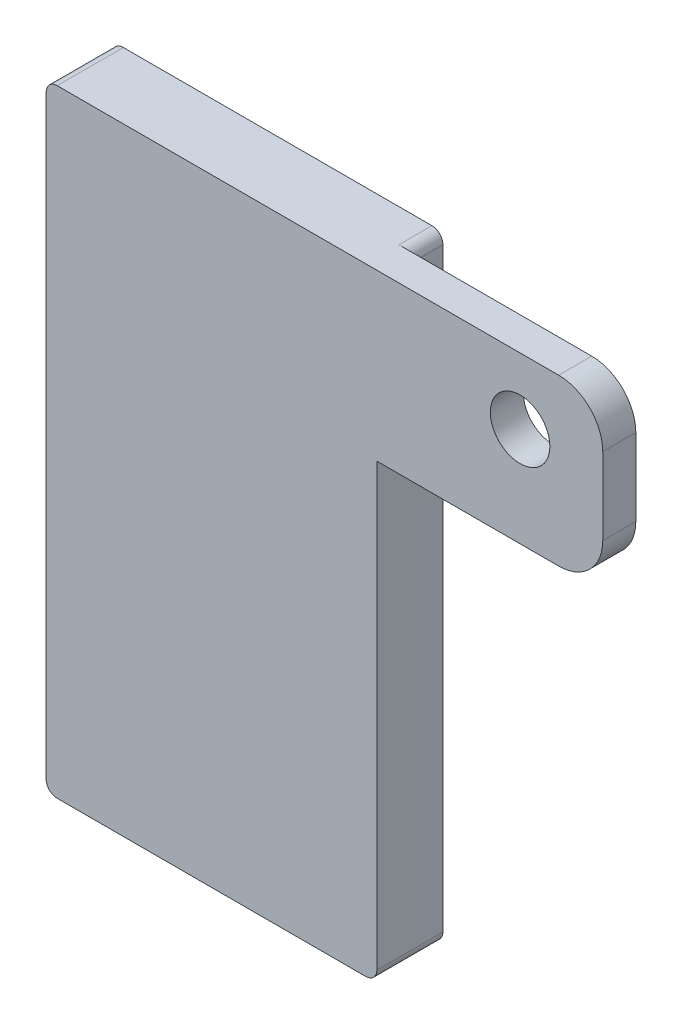
ISO-10303-21;
HEADER;
FILE_DESCRIPTION(('STEP AP214'),'2;1');
FILE_NAME('part.step','',(''),(''),'','','');
FILE_SCHEMA(('AUTOMOTIVE_DESIGN { 1 0 10303 214 1 1 1 1 }'));
ENDSEC;
DATA;
#1=APPLICATION_CONTEXT('core data for automotive mechanical design processes');
#2=APPLICATION_PROTOCOL_DEFINITION('international standard','automotive_design',2000,#1);
#3=PRODUCT_CONTEXT('',#1,'mechanical');
#4=PRODUCT('Part','Part','',(#3));
#5=PRODUCT_RELATED_PRODUCT_CATEGORY('part','',(#4));
#6=PRODUCT_DEFINITION_FORMATION('','',#4);
#7=PRODUCT_DEFINITION_CONTEXT('part definition',#1,'design');
#8=PRODUCT_DEFINITION('design','',#6,#7);
#9=PRODUCT_DEFINITION_SHAPE('','',#8);
#10=(LENGTH_UNIT() NAMED_UNIT(*) SI_UNIT(.MILLI.,.METRE.));
#11=(NAMED_UNIT(*) PLANE_ANGLE_UNIT() SI_UNIT($,.RADIAN.));
#12=(NAMED_UNIT(*) SI_UNIT($,.STERADIAN.) SOLID_ANGLE_UNIT());
#13=UNCERTAINTY_MEASURE_WITH_UNIT(LENGTH_MEASURE(1.E-05),#10,'distance_accuracy_value','');
#14=(GEOMETRIC_REPRESENTATION_CONTEXT(3) GLOBAL_UNCERTAINTY_ASSIGNED_CONTEXT((#13)) GLOBAL_UNIT_ASSIGNED_CONTEXT((#10,
#11,#12)) REPRESENTATION_CONTEXT('',''));
#15=CARTESIAN_POINT('',(0.,0.,0.));
#16=DIRECTION('',(0.,0.,1.));
#17=DIRECTION('',(1.,0.,0.));
#18=AXIS2_PLACEMENT_3D('',#15,#16,#17);
#19=CARTESIAN_POINT('',(0.,0.,3.));
#20=DIRECTION('',(0.,0.,-1.));
#21=DIRECTION('',(-1.,0.,0.));
#22=AXIS2_PLACEMENT_3D('',#19,#20,#21);
#23=PLANE('',#22);
#24=DIRECTION('',(-1.,0.,0.));
#25=VECTOR('',#24,1.);
#26=CARTESIAN_POINT('',(0.,56.,3.));
#27=LINE('',#26,#25);
#28=CARTESIAN_POINT('',(46.5,56.,3.));
#29=VERTEX_POINT('',#28);
#30=CARTESIAN_POINT('',(1.,56.,3.));
#31=VERTEX_POINT('',#30);
#32=EDGE_CURVE('E235',#29,#31,#27,.T.);
#33=ORIENTED_EDGE('',*,*,#32,.T.);
#34=CARTESIAN_POINT('',(1.,55.,3.));
#35=DIRECTION('',(0.,0.,-1.));
#36=DIRECTION('',(-1.,0.,0.));
#37=AXIS2_PLACEMENT_3D('',#34,#35,#36);
#38=CIRCLE('',#37,1.);
#39=CARTESIAN_POINT('',(0.,55.,3.));
#40=VERTEX_POINT('',#39);
#41=EDGE_CURVE('E293',#31,#40,#38,.F.);
#42=ORIENTED_EDGE('',*,*,#41,.T.);
#43=DIRECTION('',(0.,-1.,0.));
#44=VECTOR('',#43,1.);
#45=CARTESIAN_POINT('',(0.,0.,3.));
#46=LINE('',#45,#44);
#47=CARTESIAN_POINT('',(0.,1.,3.));
#48=VERTEX_POINT('',#47);
#49=EDGE_CURVE('E238',#40,#48,#46,.T.);
#50=ORIENTED_EDGE('',*,*,#49,.T.);
#51=CARTESIAN_POINT('',(1.,1.,3.));
#52=DIRECTION('',(0.,0.,-1.));
#53=DIRECTION('',(-1.,0.,0.));
#54=AXIS2_PLACEMENT_3D('',#51,#52,#53);
#55=CIRCLE('',#54,1.);
#56=CARTESIAN_POINT('',(1.00000000000001,0.,3.));
#57=VERTEX_POINT('',#56);
#58=EDGE_CURVE('E61',#48,#57,#55,.F.);
#59=ORIENTED_EDGE('',*,*,#58,.T.);
#60=DIRECTION('',(1.,0.,0.));
#61=VECTOR('',#60,1.);
#62=CARTESIAN_POINT('',(30.,0.,3.));
#63=LINE('',#62,#61);
#64=CARTESIAN_POINT('',(29.,0.,3.));
#65=VERTEX_POINT('',#64);
#66=EDGE_CURVE('E224',#57,#65,#63,.T.);
#67=ORIENTED_EDGE('',*,*,#66,.T.);
#68=CARTESIAN_POINT('',(29.,1.,3.));
#69=DIRECTION('',(0.,0.,-1.));
#70=DIRECTION('',(-1.,0.,0.));
#71=AXIS2_PLACEMENT_3D('',#68,#69,#70);
#72=CIRCLE('',#71,1.);
#73=CARTESIAN_POINT('',(30.,1.,3.));
#74=VERTEX_POINT('',#73);
#75=EDGE_CURVE('E290',#65,#74,#72,.F.);
#76=ORIENTED_EDGE('',*,*,#75,.T.);
#77=DIRECTION('',(0.,1.,0.));
#78=VECTOR('',#77,1.);
#79=CARTESIAN_POINT('',(30.,41.,3.));
#80=LINE('',#79,#78);
#81=CARTESIAN_POINT('',(30.,41.,3.));
#82=VERTEX_POINT('',#81);
#83=EDGE_CURVE('E226',#74,#82,#80,.T.);
#84=ORIENTED_EDGE('',*,*,#83,.T.);
#85=DIRECTION('',(1.,0.,0.));
#86=VECTOR('',#85,1.);
#87=CARTESIAN_POINT('',(50.5,41.,3.));
#88=LINE('',#87,#86);
#89=CARTESIAN_POINT('',(46.5,41.,3.));
#90=VERTEX_POINT('',#89);
#91=EDGE_CURVE('E229',#82,#90,#88,.T.);
#92=ORIENTED_EDGE('',*,*,#91,.T.);
#93=CARTESIAN_POINT('',(46.5,45.,3.));
#94=DIRECTION('',(0.,0.,-1.));
#95=DIRECTION('',(-1.,0.,0.));
#96=AXIS2_PLACEMENT_3D('',#93,#94,#95);
#97=CIRCLE('',#96,4.);
#98=CARTESIAN_POINT('',(50.5,45.,3.));
#99=VERTEX_POINT('',#98);
#100=EDGE_CURVE('E262',#90,#99,#97,.F.);
#101=ORIENTED_EDGE('',*,*,#100,.T.);
#102=DIRECTION('',(0.,1.,0.));
#103=VECTOR('',#102,1.);
#104=CARTESIAN_POINT('',(50.5,56.,3.));
#105=LINE('',#104,#103);
#106=CARTESIAN_POINT('',(50.5,52.,3.));
#107=VERTEX_POINT('',#106);
#108=EDGE_CURVE('E232',#99,#107,#105,.T.);
#109=ORIENTED_EDGE('',*,*,#108,.T.);
#110=CARTESIAN_POINT('',(46.5,52.,3.));
#111=DIRECTION('',(0.,0.,-1.));
#112=DIRECTION('',(-1.,0.,0.));
#113=AXIS2_PLACEMENT_3D('',#110,#111,#112);
#114=CIRCLE('',#113,4.);
#115=EDGE_CURVE('E260',#107,#29,#114,.F.);
#116=ORIENTED_EDGE('',*,*,#115,.T.);
#117=EDGE_LOOP('',(#33,#42,#50,#59,#67,#76,#84,#92,#101,#109,#116));
#118=FACE_BOUND('',#117,.T.);
#119=CARTESIAN_POINT('',(43.,50.,3.));
#120=DIRECTION('',(0.,0.,1.));
#121=DIRECTION('',(1.,0.,0.));
#122=AXIS2_PLACEMENT_3D('',#119,#120,#121);
#123=CIRCLE('',#122,2.7);
#124=CARTESIAN_POINT('',(45.7,50.,3.));
#125=VERTEX_POINT('',#124);
#126=EDGE_CURVE('E218',#125,#125,#123,.T.);
#127=ORIENTED_EDGE('',*,*,#126,.F.);
#128=EDGE_LOOP('',(#127));
#129=FACE_BOUND('',#128,.T.);
#130=ADVANCED_FACE('F39',(#118,#129),#23,.F.);
#131=CARTESIAN_POINT('',(0.,0.,0.));
#132=DIRECTION('',(0.,0.,-1.));
#133=DIRECTION('',(-1.,0.,0.));
#134=AXIS2_PLACEMENT_3D('',#131,#132,#133);
#135=PLANE('',#134);
#136=DIRECTION('',(0.,1.,0.));
#137=VECTOR('',#136,1.);
#138=CARTESIAN_POINT('',(50.5,56.,0.));
#139=LINE('',#138,#137);
#140=CARTESIAN_POINT('',(50.5,45.,0.));
#141=VERTEX_POINT('',#140);
#142=CARTESIAN_POINT('',(50.5,52.,0.));
#143=VERTEX_POINT('',#142);
#144=EDGE_CURVE('E243',#141,#143,#139,.T.);
#145=ORIENTED_EDGE('',*,*,#144,.F.);
#146=CARTESIAN_POINT('',(46.5,45.,0.));
#147=DIRECTION('',(0.,0.,-1.));
#148=DIRECTION('',(-1.,0.,0.));
#149=AXIS2_PLACEMENT_3D('',#146,#147,#148);
#150=CIRCLE('',#149,4.);
#151=CARTESIAN_POINT('',(46.5,41.,0.));
#152=VERTEX_POINT('',#151);
#153=EDGE_CURVE('E256',#141,#152,#150,.T.);
#154=ORIENTED_EDGE('',*,*,#153,.T.);
#155=DIRECTION('',(1.,0.,0.));
#156=VECTOR('',#155,1.);
#157=CARTESIAN_POINT('',(50.5,41.,0.));
#158=LINE('',#157,#156);
#159=CARTESIAN_POINT('',(30.,41.,0.));
#160=VERTEX_POINT('',#159);
#161=EDGE_CURVE('E221',#160,#152,#158,.T.);
#162=ORIENTED_EDGE('',*,*,#161,.F.);
#163=DIRECTION('',(0.,-1.,0.));
#164=VECTOR('',#163,1.);
#165=CARTESIAN_POINT('',(30.,0.,0.));
#166=LINE('',#165,#164);
#167=CARTESIAN_POINT('',(30.,55.,0.));
#168=VERTEX_POINT('',#167);
#169=EDGE_CURVE('E179',#168,#160,#166,.T.);
#170=ORIENTED_EDGE('',*,*,#169,.F.);
#171=CARTESIAN_POINT('',(29.,55.,0.));
#172=DIRECTION('',(0.,0.,-1.));
#173=DIRECTION('',(-1.,0.,0.));
#174=AXIS2_PLACEMENT_3D('',#171,#172,#173);
#175=CIRCLE('',#174,1.);
#176=CARTESIAN_POINT('',(29.,56.,0.));
#177=VERTEX_POINT('',#176);
#178=EDGE_CURVE('E11',#168,#177,#175,.F.);
#179=ORIENTED_EDGE('',*,*,#178,.T.);
#180=DIRECTION('',(-1.,0.,0.));
#181=VECTOR('',#180,1.);
#182=CARTESIAN_POINT('',(0.,56.,0.));
#183=LINE('',#182,#181);
#184=CARTESIAN_POINT('',(46.5,56.,0.));
#185=VERTEX_POINT('',#184);
#186=EDGE_CURVE('E227',#185,#177,#183,.T.);
#187=ORIENTED_EDGE('',*,*,#186,.F.);
#188=CARTESIAN_POINT('',(46.5,52.,0.));
#189=DIRECTION('',(0.,0.,-1.));
#190=DIRECTION('',(-1.,0.,0.));
#191=AXIS2_PLACEMENT_3D('',#188,#189,#190);
#192=CIRCLE('',#191,4.);
#193=EDGE_CURVE('E254',#185,#143,#192,.T.);
#194=ORIENTED_EDGE('',*,*,#193,.T.);
#195=EDGE_LOOP('',(#145,#154,#162,#170,#179,#187,#194));
#196=FACE_BOUND('',#195,.T.);
#197=CARTESIAN_POINT('',(43.,50.,0.));
#198=DIRECTION('',(0.,0.,1.));
#199=DIRECTION('',(1.,0.,0.));
#200=AXIS2_PLACEMENT_3D('',#197,#198,#199);
#201=CIRCLE('',#200,2.7);
#202=CARTESIAN_POINT('',(45.7,50.,0.));
#203=VERTEX_POINT('',#202);
#204=EDGE_CURVE('E216',#203,#203,#201,.T.);
#205=ORIENTED_EDGE('',*,*,#204,.T.);
#206=EDGE_LOOP('',(#205));
#207=FACE_BOUND('',#206,.T.);
#208=ADVANCED_FACE('F324',(#196,#207),#135,.T.);
#209=CARTESIAN_POINT('',(30.,0.,3.));
#210=DIRECTION('',(0.,1.,0.));
#211=DIRECTION('',(0.,0.,1.));
#212=AXIS2_PLACEMENT_3D('',#209,#210,#211);
#213=PLANE('',#212);
#214=ORIENTED_EDGE('',*,*,#66,.F.);
#215=DIRECTION('',(0.,0.,-1.));
#216=VECTOR('',#215,1.);
#217=CARTESIAN_POINT('',(1.,0.,3.));
#218=LINE('',#217,#216);
#219=CARTESIAN_POINT('',(1.00000000000001,0.,-3.));
#220=VERTEX_POINT('',#219);
#221=EDGE_CURVE('E47',#57,#220,#218,.T.);
#222=ORIENTED_EDGE('',*,*,#221,.T.);
#223=DIRECTION('',(-1.,0.,0.));
#224=VECTOR('',#223,1.);
#225=CARTESIAN_POINT('',(30.,0.,-3.));
#226=LINE('',#225,#224);
#227=CARTESIAN_POINT('',(29.,0.,-3.));
#228=VERTEX_POINT('',#227);
#229=EDGE_CURVE('E207',#228,#220,#226,.T.);
#230=ORIENTED_EDGE('',*,*,#229,.F.);
#231=DIRECTION('',(0.,0.,-1.));
#232=VECTOR('',#231,1.);
#233=CARTESIAN_POINT('',(29.,0.,3.));
#234=LINE('',#233,#232);
#235=EDGE_CURVE('E54',#228,#65,#234,.F.);
#236=ORIENTED_EDGE('',*,*,#235,.T.);
#237=EDGE_LOOP('',(#214,#222,#230,#236));
#238=FACE_BOUND('',#237,.T.);
#239=ADVANCED_FACE('F297',(#238),#213,.F.);
#240=CARTESIAN_POINT('',(30.,41.,3.));
#241=DIRECTION('',(-1.,0.,0.));
#242=DIRECTION('',(0.,-1.,0.));
#243=AXIS2_PLACEMENT_3D('',#240,#241,#242);
#244=PLANE('',#243);
#245=DIRECTION('',(0.,-1.,0.));
#246=VECTOR('',#245,1.);
#247=CARTESIAN_POINT('',(30.,0.,-3.));
#248=LINE('',#247,#246);
#249=CARTESIAN_POINT('',(30.,55.,-3.));
#250=VERTEX_POINT('',#249);
#251=CARTESIAN_POINT('',(30.,1.,-3.));
#252=VERTEX_POINT('',#251);
#253=EDGE_CURVE('E204',#250,#252,#248,.T.);
#254=ORIENTED_EDGE('',*,*,#253,.F.);
#255=DIRECTION('',(0.,0.,1.));
#256=VECTOR('',#255,1.);
#257=CARTESIAN_POINT('',(30.,55.,3.));
#258=LINE('',#257,#256);
#259=EDGE_CURVE('E270',#250,#168,#258,.T.);
#260=ORIENTED_EDGE('',*,*,#259,.T.);
#261=ORIENTED_EDGE('',*,*,#169,.T.);
#262=DIRECTION('',(0.,0.,-1.));
#263=VECTOR('',#262,1.);
#264=CARTESIAN_POINT('',(30.,41.,3.));
#265=LINE('',#264,#263);
#266=EDGE_CURVE('E240',#82,#160,#265,.T.);
#267=ORIENTED_EDGE('',*,*,#266,.F.);
#268=ORIENTED_EDGE('',*,*,#83,.F.);
#269=DIRECTION('',(0.,0.,-1.));
#270=VECTOR('',#269,1.);
#271=CARTESIAN_POINT('',(30.,1.,3.));
#272=LINE('',#271,#270);
#273=EDGE_CURVE('E267',#74,#252,#272,.T.);
#274=ORIENTED_EDGE('',*,*,#273,.T.);
#275=EDGE_LOOP('',(#254,#260,#261,#267,#268,#274));
#276=FACE_BOUND('',#275,.T.);
#277=ADVANCED_FACE('F307',(#276),#244,.F.);
#278=CARTESIAN_POINT('',(50.5,41.,3.));
#279=DIRECTION('',(0.,1.,0.));
#280=DIRECTION('',(0.,0.,1.));
#281=AXIS2_PLACEMENT_3D('',#278,#279,#280);
#282=PLANE('',#281);
#283=ORIENTED_EDGE('',*,*,#161,.T.);
#284=DIRECTION('',(0.,0.,-1.));
#285=VECTOR('',#284,1.);
#286=CARTESIAN_POINT('',(46.5,41.,3.));
#287=LINE('',#286,#285);
#288=EDGE_CURVE('E258',#152,#90,#287,.F.);
#289=ORIENTED_EDGE('',*,*,#288,.T.);
#290=ORIENTED_EDGE('',*,*,#91,.F.);
#291=ORIENTED_EDGE('',*,*,#266,.T.);
#292=EDGE_LOOP('',(#283,#289,#290,#291));
#293=FACE_BOUND('',#292,.T.);
#294=ADVANCED_FACE('F350',(#293),#282,.F.);
#295=CARTESIAN_POINT('',(50.5,56.,3.));
#296=DIRECTION('',(-1.,0.,0.));
#297=DIRECTION('',(0.,-1.,0.));
#298=AXIS2_PLACEMENT_3D('',#295,#296,#297);
#299=PLANE('',#298);
#300=ORIENTED_EDGE('',*,*,#108,.F.);
#301=DIRECTION('',(0.,0.,-1.));
#302=VECTOR('',#301,1.);
#303=CARTESIAN_POINT('',(50.5,45.,3.));
#304=LINE('',#303,#302);
#305=EDGE_CURVE('E251',#99,#141,#304,.T.);
#306=ORIENTED_EDGE('',*,*,#305,.T.);
#307=ORIENTED_EDGE('',*,*,#144,.T.);
#308=DIRECTION('',(0.,0.,-1.));
#309=VECTOR('',#308,1.);
#310=CARTESIAN_POINT('',(50.5,52.,3.));
#311=LINE('',#310,#309);
#312=EDGE_CURVE('E249',#143,#107,#311,.F.);
#313=ORIENTED_EDGE('',*,*,#312,.T.);
#314=EDGE_LOOP('',(#300,#306,#307,#313));
#315=FACE_BOUND('',#314,.T.);
#316=ADVANCED_FACE('F321',(#315),#299,.F.);
#317=CARTESIAN_POINT('',(0.,56.,3.));
#318=DIRECTION('',(0.,-1.,0.));
#319=DIRECTION('',(1.,0.,0.));
#320=AXIS2_PLACEMENT_3D('',#317,#318,#319);
#321=PLANE('',#320);
#322=ORIENTED_EDGE('',*,*,#186,.T.);
#323=DIRECTION('',(0.,0.,1.));
#324=VECTOR('',#323,1.);
#325=CARTESIAN_POINT('',(29.,56.,3.));
#326=LINE('',#325,#324);
#327=CARTESIAN_POINT('',(29.,56.,-3.));
#328=VERTEX_POINT('',#327);
#329=EDGE_CURVE('E275',#177,#328,#326,.F.);
#330=ORIENTED_EDGE('',*,*,#329,.T.);
#331=DIRECTION('',(1.,0.,0.));
#332=VECTOR('',#331,1.);
#333=CARTESIAN_POINT('',(30.,56.,-3.));
#334=LINE('',#333,#332);
#335=CARTESIAN_POINT('',(1.00000000000001,56.,-3.));
#336=VERTEX_POINT('',#335);
#337=EDGE_CURVE('E213',#336,#328,#334,.T.);
#338=ORIENTED_EDGE('',*,*,#337,.F.);
#339=DIRECTION('',(0.,0.,-1.));
#340=VECTOR('',#339,1.);
#341=CARTESIAN_POINT('',(1.,56.,3.));
#342=LINE('',#341,#340);
#343=EDGE_CURVE('E273',#336,#31,#342,.F.);
#344=ORIENTED_EDGE('',*,*,#343,.T.);
#345=ORIENTED_EDGE('',*,*,#32,.F.);
#346=DIRECTION('',(0.,0.,-1.));
#347=VECTOR('',#346,1.);
#348=CARTESIAN_POINT('',(46.5,56.,3.));
#349=LINE('',#348,#347);
#350=EDGE_CURVE('E264',#29,#185,#349,.T.);
#351=ORIENTED_EDGE('',*,*,#350,.T.);
#352=EDGE_LOOP('',(#322,#330,#338,#344,#345,#351));
#353=FACE_BOUND('',#352,.T.);
#354=ADVANCED_FACE('F334',(#353),#321,.F.);
#355=CARTESIAN_POINT('',(0.,0.,3.));
#356=DIRECTION('',(1.,0.,0.));
#357=DIRECTION('',(0.,0.,-1.));
#358=AXIS2_PLACEMENT_3D('',#355,#356,#357);
#359=PLANE('',#358);
#360=ORIENTED_EDGE('',*,*,#49,.F.);
#361=DIRECTION('',(0.,0.,-1.));
#362=VECTOR('',#361,1.);
#363=CARTESIAN_POINT('',(0.,55.,3.));
#364=LINE('',#363,#362);
#365=CARTESIAN_POINT('',(0.,55.,-3.));
#366=VERTEX_POINT('',#365);
#367=EDGE_CURVE('E287',#40,#366,#364,.T.);
#368=ORIENTED_EDGE('',*,*,#367,.T.);
#369=DIRECTION('',(0.,1.,0.));
#370=VECTOR('',#369,1.);
#371=CARTESIAN_POINT('',(0.,0.,-3.));
#372=LINE('',#371,#370);
#373=CARTESIAN_POINT('',(0.,1.,-3.));
#374=VERTEX_POINT('',#373);
#375=EDGE_CURVE('E210',#374,#366,#372,.T.);
#376=ORIENTED_EDGE('',*,*,#375,.F.);
#377=DIRECTION('',(0.,0.,-1.));
#378=VECTOR('',#377,1.);
#379=CARTESIAN_POINT('',(0.,1.,3.));
#380=LINE('',#379,#378);
#381=EDGE_CURVE('E285',#374,#48,#380,.F.);
#382=ORIENTED_EDGE('',*,*,#381,.T.);
#383=EDGE_LOOP('',(#360,#368,#376,#382));
#384=FACE_BOUND('',#383,.T.);
#385=ADVANCED_FACE('F343',(#384),#359,.F.);
#386=CARTESIAN_POINT('',(43.,50.,3.));
#387=DIRECTION('',(0.,0.,-1.));
#388=DIRECTION('',(-1.,0.,0.));
#389=AXIS2_PLACEMENT_3D('',#386,#387,#388);
#390=CYLINDRICAL_SURFACE('',#389,2.7);
#391=ORIENTED_EDGE('',*,*,#126,.T.);
#392=EDGE_LOOP('',(#391));
#393=FACE_BOUND('',#392,.T.);
#394=ORIENTED_EDGE('',*,*,#204,.F.);
#395=EDGE_LOOP('',(#394));
#396=FACE_BOUND('',#395,.T.);
#397=ADVANCED_FACE('F369',(#393,#396),#390,.F.);
#398=CARTESIAN_POINT('',(0.,0.,-3.));
#399=DIRECTION('',(0.,0.,1.));
#400=DIRECTION('',(1.,0.,0.));
#401=AXIS2_PLACEMENT_3D('',#398,#399,#400);
#402=PLANE('',#401);
#403=ORIENTED_EDGE('',*,*,#337,.T.);
#404=CARTESIAN_POINT('',(29.,55.,-3.));
#405=DIRECTION('',(0.,0.,1.));
#406=DIRECTION('',(1.,0.,0.));
#407=AXIS2_PLACEMENT_3D('',#404,#405,#406);
#408=CIRCLE('',#407,1.);
#409=EDGE_CURVE('E283',#328,#250,#408,.F.);
#410=ORIENTED_EDGE('',*,*,#409,.T.);
#411=ORIENTED_EDGE('',*,*,#253,.T.);
#412=CARTESIAN_POINT('',(29.,1.,-3.));
#413=DIRECTION('',(0.,0.,1.));
#414=DIRECTION('',(1.,0.,0.));
#415=AXIS2_PLACEMENT_3D('',#412,#413,#414);
#416=CIRCLE('',#415,1.);
#417=EDGE_CURVE('E277',#252,#228,#416,.F.);
#418=ORIENTED_EDGE('',*,*,#417,.T.);
#419=ORIENTED_EDGE('',*,*,#229,.T.);
#420=CARTESIAN_POINT('',(1.,1.,-3.));
#421=DIRECTION('',(0.,0.,1.));
#422=DIRECTION('',(1.,0.,0.));
#423=AXIS2_PLACEMENT_3D('',#420,#421,#422);
#424=CIRCLE('',#423,1.);
#425=EDGE_CURVE('E279',#220,#374,#424,.F.);
#426=ORIENTED_EDGE('',*,*,#425,.T.);
#427=ORIENTED_EDGE('',*,*,#375,.T.);
#428=CARTESIAN_POINT('',(1.,55.,-3.));
#429=DIRECTION('',(0.,0.,1.));
#430=DIRECTION('',(1.,0.,0.));
#431=AXIS2_PLACEMENT_3D('',#428,#429,#430);
#432=CIRCLE('',#431,1.);
#433=EDGE_CURVE('E281',#366,#336,#432,.F.);
#434=ORIENTED_EDGE('',*,*,#433,.T.);
#435=EDGE_LOOP('',(#403,#410,#411,#418,#419,#426,#427,#434));
#436=FACE_BOUND('',#435,.T.);
#437=DIRECTION('',(0.,-1.,0.));
#438=VECTOR('',#437,1.);
#439=CARTESIAN_POINT('',(25.,51.,-3.));
#440=LINE('',#439,#438);
#441=CARTESIAN_POINT('',(25.,51.,-3.));
#442=VERTEX_POINT('',#441);
#443=CARTESIAN_POINT('',(25.,5.,-3.));
#444=VERTEX_POINT('',#443);
#445=EDGE_CURVE('E161',#442,#444,#440,.T.);
#446=ORIENTED_EDGE('',*,*,#445,.F.);
#447=DIRECTION('',(1.,0.,0.));
#448=VECTOR('',#447,1.);
#449=CARTESIAN_POINT('',(25.,51.,-3.));
#450=LINE('',#449,#448);
#451=CARTESIAN_POINT('',(5.,51.,-3.));
#452=VERTEX_POINT('',#451);
#453=EDGE_CURVE('E187',#452,#442,#450,.T.);
#454=ORIENTED_EDGE('',*,*,#453,.F.);
#455=DIRECTION('',(0.,1.,0.));
#456=VECTOR('',#455,1.);
#457=CARTESIAN_POINT('',(5.,51.,-3.));
#458=LINE('',#457,#456);
#459=CARTESIAN_POINT('',(4.99999999999999,5.,-3.));
#460=VERTEX_POINT('',#459);
#461=EDGE_CURVE('E185',#460,#452,#458,.T.);
#462=ORIENTED_EDGE('',*,*,#461,.F.);
#463=DIRECTION('',(-1.,0.,0.));
#464=VECTOR('',#463,1.);
#465=CARTESIAN_POINT('',(25.,5.,-3.));
#466=LINE('',#465,#464);
#467=EDGE_CURVE('E171',#444,#460,#466,.T.);
#468=ORIENTED_EDGE('',*,*,#467,.F.);
#469=EDGE_LOOP('',(#446,#454,#462,#468));
#470=FACE_BOUND('',#469,.T.);
#471=ADVANCED_FACE('F183',(#436,#470),#402,.F.);
#472=CARTESIAN_POINT('',(25.,51.,-3.));
#473=DIRECTION('',(-1.,0.,0.));
#474=DIRECTION('',(0.,-1.,0.));
#475=AXIS2_PLACEMENT_3D('',#472,#473,#474);
#476=PLANE('',#475);
#477=DIRECTION('',(0.,-1.,0.));
#478=VECTOR('',#477,1.);
#479=CARTESIAN_POINT('',(25.,51.,0.));
#480=LINE('',#479,#478);
#481=CARTESIAN_POINT('',(25.,51.,0.));
#482=VERTEX_POINT('',#481);
#483=CARTESIAN_POINT('',(25.,5.,0.));
#484=VERTEX_POINT('',#483);
#485=EDGE_CURVE('E191',#482,#484,#480,.T.);
#486=ORIENTED_EDGE('',*,*,#485,.F.);
#487=DIRECTION('',(0.,0.,1.));
#488=VECTOR('',#487,1.);
#489=CARTESIAN_POINT('',(25.,51.,-3.));
#490=LINE('',#489,#488);
#491=EDGE_CURVE('E167',#442,#482,#490,.T.);
#492=ORIENTED_EDGE('',*,*,#491,.F.);
#493=ORIENTED_EDGE('',*,*,#445,.T.);
#494=DIRECTION('',(0.,0.,1.));
#495=VECTOR('',#494,1.);
#496=CARTESIAN_POINT('',(25.,5.,-3.));
#497=LINE('',#496,#495);
#498=EDGE_CURVE('E164',#444,#484,#497,.T.);
#499=ORIENTED_EDGE('',*,*,#498,.T.);
#500=EDGE_LOOP('',(#486,#492,#493,#499));
#501=FACE_BOUND('',#500,.T.);
#502=ADVANCED_FACE('F163',(#501),#476,.T.);
#503=CARTESIAN_POINT('',(25.,5.,-3.));
#504=DIRECTION('',(0.,1.,0.));
#505=DIRECTION('',(0.,0.,1.));
#506=AXIS2_PLACEMENT_3D('',#503,#504,#505);
#507=PLANE('',#506);
#508=DIRECTION('',(-1.,0.,0.));
#509=VECTOR('',#508,1.);
#510=CARTESIAN_POINT('',(25.,5.,0.));
#511=LINE('',#510,#509);
#512=CARTESIAN_POINT('',(4.99999999999999,5.,0.));
#513=VERTEX_POINT('',#512);
#514=EDGE_CURVE('E178',#484,#513,#511,.T.);
#515=ORIENTED_EDGE('',*,*,#514,.F.);
#516=ORIENTED_EDGE('',*,*,#498,.F.);
#517=ORIENTED_EDGE('',*,*,#467,.T.);
#518=DIRECTION('',(0.,0.,1.));
#519=VECTOR('',#518,1.);
#520=CARTESIAN_POINT('',(4.99999999999999,5.,-3.));
#521=LINE('',#520,#519);
#522=EDGE_CURVE('E180',#460,#513,#521,.T.);
#523=ORIENTED_EDGE('',*,*,#522,.T.);
#524=EDGE_LOOP('',(#515,#516,#517,#523));
#525=FACE_BOUND('',#524,.T.);
#526=ADVANCED_FACE('F175',(#525),#507,.T.);
#527=CARTESIAN_POINT('',(5.,51.,-3.));
#528=DIRECTION('',(1.,0.,0.));
#529=DIRECTION('',(0.,1.,0.));
#530=AXIS2_PLACEMENT_3D('',#527,#528,#529);
#531=PLANE('',#530);
#532=DIRECTION('',(0.,1.,0.));
#533=VECTOR('',#532,1.);
#534=CARTESIAN_POINT('',(5.,51.,0.));
#535=LINE('',#534,#533);
#536=CARTESIAN_POINT('',(5.,51.,0.));
#537=VERTEX_POINT('',#536);
#538=EDGE_CURVE('E194',#513,#537,#535,.T.);
#539=ORIENTED_EDGE('',*,*,#538,.F.);
#540=ORIENTED_EDGE('',*,*,#522,.F.);
#541=ORIENTED_EDGE('',*,*,#461,.T.);
#542=DIRECTION('',(0.,0.,1.));
#543=VECTOR('',#542,1.);
#544=CARTESIAN_POINT('',(5.,51.,-3.));
#545=LINE('',#544,#543);
#546=EDGE_CURVE('E200',#452,#537,#545,.T.);
#547=ORIENTED_EDGE('',*,*,#546,.T.);
#548=EDGE_LOOP('',(#539,#540,#541,#547));
#549=FACE_BOUND('',#548,.T.);
#550=ADVANCED_FACE('F445',(#549),#531,.T.);
#551=CARTESIAN_POINT('',(25.,51.,-3.));
#552=DIRECTION('',(0.,-1.,0.));
#553=DIRECTION('',(0.,0.,-1.));
#554=AXIS2_PLACEMENT_3D('',#551,#552,#553);
#555=PLANE('',#554);
#556=DIRECTION('',(1.,0.,0.));
#557=VECTOR('',#556,1.);
#558=CARTESIAN_POINT('',(25.,51.,0.));
#559=LINE('',#558,#557);
#560=EDGE_CURVE('E172',#537,#482,#559,.T.);
#561=ORIENTED_EDGE('',*,*,#560,.F.);
#562=ORIENTED_EDGE('',*,*,#546,.F.);
#563=ORIENTED_EDGE('',*,*,#453,.T.);
#564=ORIENTED_EDGE('',*,*,#491,.T.);
#565=EDGE_LOOP('',(#561,#562,#563,#564));
#566=FACE_BOUND('',#565,.T.);
#567=ADVANCED_FACE('F441',(#566),#555,.T.);
#568=ORIENTED_EDGE('',*,*,#538,.T.);
#569=ORIENTED_EDGE('',*,*,#560,.T.);
#570=ORIENTED_EDGE('',*,*,#485,.T.);
#571=ORIENTED_EDGE('',*,*,#514,.T.);
#572=EDGE_LOOP('',(#568,#569,#570,#571));
#573=FACE_BOUND('',#572,.T.);
#574=ADVANCED_FACE('F367',(#573),#135,.T.);
#575=CARTESIAN_POINT('',(46.5,45.,3.));
#576=DIRECTION('',(0.,0.,-1.));
#577=DIRECTION('',(-1.,0.,0.));
#578=AXIS2_PLACEMENT_3D('',#575,#576,#577);
#579=CYLINDRICAL_SURFACE('',#578,4.);
#580=ORIENTED_EDGE('',*,*,#100,.F.);
#581=ORIENTED_EDGE('',*,*,#288,.F.);
#582=ORIENTED_EDGE('',*,*,#153,.F.);
#583=ORIENTED_EDGE('',*,*,#305,.F.);
#584=EDGE_LOOP('',(#580,#581,#582,#583));
#585=FACE_BOUND('',#584,.T.);
#586=ADVANCED_FACE('F318',(#585),#579,.T.);
#587=CARTESIAN_POINT('',(46.5,52.,3.));
#588=DIRECTION('',(0.,0.,-1.));
#589=DIRECTION('',(-1.,0.,0.));
#590=AXIS2_PLACEMENT_3D('',#587,#588,#589);
#591=CYLINDRICAL_SURFACE('',#590,4.);
#592=ORIENTED_EDGE('',*,*,#115,.F.);
#593=ORIENTED_EDGE('',*,*,#312,.F.);
#594=ORIENTED_EDGE('',*,*,#193,.F.);
#595=ORIENTED_EDGE('',*,*,#350,.F.);
#596=EDGE_LOOP('',(#592,#593,#594,#595));
#597=FACE_BOUND('',#596,.T.);
#598=ADVANCED_FACE('F331',(#597),#591,.T.);
#599=CARTESIAN_POINT('',(29.,55.,3.));
#600=DIRECTION('',(0.,0.,1.));
#601=DIRECTION('',(1.,0.,0.));
#602=AXIS2_PLACEMENT_3D('',#599,#600,#601);
#603=CYLINDRICAL_SURFACE('',#602,1.);
#604=ORIENTED_EDGE('',*,*,#409,.F.);
#605=ORIENTED_EDGE('',*,*,#329,.F.);
#606=ORIENTED_EDGE('',*,*,#178,.F.);
#607=ORIENTED_EDGE('',*,*,#259,.F.);
#608=EDGE_LOOP('',(#604,#605,#606,#607));
#609=FACE_BOUND('',#608,.T.);
#610=ADVANCED_FACE('F348',(#609),#603,.T.);
#611=CARTESIAN_POINT('',(1.,55.,3.));
#612=DIRECTION('',(0.,0.,-1.));
#613=DIRECTION('',(-1.,0.,0.));
#614=AXIS2_PLACEMENT_3D('',#611,#612,#613);
#615=CYLINDRICAL_SURFACE('',#614,1.);
#616=ORIENTED_EDGE('',*,*,#41,.F.);
#617=ORIENTED_EDGE('',*,*,#343,.F.);
#618=ORIENTED_EDGE('',*,*,#433,.F.);
#619=ORIENTED_EDGE('',*,*,#367,.F.);
#620=EDGE_LOOP('',(#616,#617,#618,#619));
#621=FACE_BOUND('',#620,.T.);
#622=ADVANCED_FACE('F341',(#621),#615,.T.);
#623=CARTESIAN_POINT('',(1.,1.,3.));
#624=DIRECTION('',(0.,0.,-1.));
#625=DIRECTION('',(-1.,0.,0.));
#626=AXIS2_PLACEMENT_3D('',#623,#624,#625);
#627=CYLINDRICAL_SURFACE('',#626,1.);
#628=ORIENTED_EDGE('',*,*,#58,.F.);
#629=ORIENTED_EDGE('',*,*,#381,.F.);
#630=ORIENTED_EDGE('',*,*,#425,.F.);
#631=ORIENTED_EDGE('',*,*,#221,.F.);
#632=EDGE_LOOP('',(#628,#629,#630,#631));
#633=FACE_BOUND('',#632,.T.);
#634=ADVANCED_FACE('F407',(#633),#627,.T.);
#635=CARTESIAN_POINT('',(29.,1.,3.));
#636=DIRECTION('',(0.,0.,-1.));
#637=DIRECTION('',(-1.,0.,0.));
#638=AXIS2_PLACEMENT_3D('',#635,#636,#637);
#639=CYLINDRICAL_SURFACE('',#638,1.);
#640=ORIENTED_EDGE('',*,*,#75,.F.);
#641=ORIENTED_EDGE('',*,*,#235,.F.);
#642=ORIENTED_EDGE('',*,*,#417,.F.);
#643=ORIENTED_EDGE('',*,*,#273,.F.);
#644=EDGE_LOOP('',(#640,#641,#642,#643));
#645=FACE_BOUND('',#644,.T.);
#646=ADVANCED_FACE('F41',(#645),#639,.T.);
#647=CLOSED_SHELL('',(#130,#208,#239,#277,#294,#316,#354,#385,#397,#471,#502,#526,#550,#567,
#574,#586,#598,#610,#622,#634,#646));
#648=MANIFOLD_SOLID_BREP('B2',#647);
#649=ADVANCED_BREP_SHAPE_REPRESENTATION('',(#18,#648),#14);
#650=SHAPE_DEFINITION_REPRESENTATION(#9,#649);
ENDSEC;
END-ISO-10303-21;
